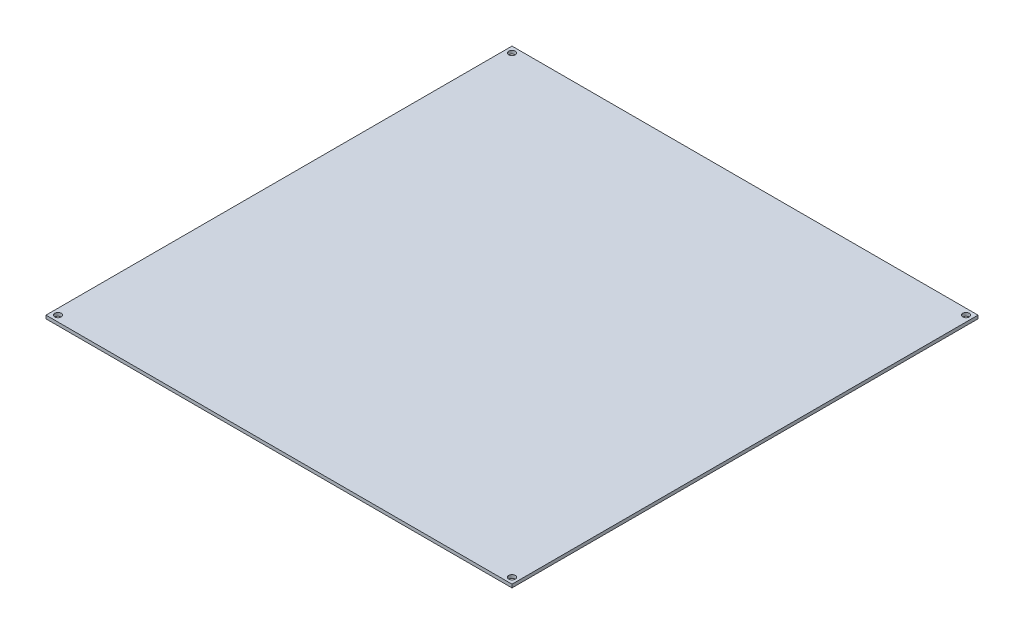
ISO-10303-21;
HEADER;
FILE_DESCRIPTION(('STEP AP214'),'2;1');
FILE_NAME('part.step','',(''),(''),'','','');
FILE_SCHEMA(('AUTOMOTIVE_DESIGN { 1 0 10303 214 1 1 1 1 }'));
ENDSEC;
DATA;
#1=APPLICATION_CONTEXT('core data for automotive mechanical design processes');
#2=APPLICATION_PROTOCOL_DEFINITION('international standard','automotive_design',2000,#1);
#3=PRODUCT_CONTEXT('',#1,'mechanical');
#4=PRODUCT('Part','Part','',(#3));
#5=PRODUCT_RELATED_PRODUCT_CATEGORY('part','',(#4));
#6=PRODUCT_DEFINITION_FORMATION('','',#4);
#7=PRODUCT_DEFINITION_CONTEXT('part definition',#1,'design');
#8=PRODUCT_DEFINITION('design','',#6,#7);
#9=PRODUCT_DEFINITION_SHAPE('','',#8);
#10=(LENGTH_UNIT() NAMED_UNIT(*) SI_UNIT(.MILLI.,.METRE.));
#11=(NAMED_UNIT(*) PLANE_ANGLE_UNIT() SI_UNIT($,.RADIAN.));
#12=(NAMED_UNIT(*) SI_UNIT($,.STERADIAN.) SOLID_ANGLE_UNIT());
#13=UNCERTAINTY_MEASURE_WITH_UNIT(LENGTH_MEASURE(1.E-05),#10,'distance_accuracy_value','');
#14=(GEOMETRIC_REPRESENTATION_CONTEXT(3) GLOBAL_UNCERTAINTY_ASSIGNED_CONTEXT((#13)) GLOBAL_UNIT_ASSIGNED_CONTEXT((#10,
#11,#12)) REPRESENTATION_CONTEXT('',''));
#15=CARTESIAN_POINT('',(0.,0.,0.));
#16=DIRECTION('',(0.,0.,1.));
#17=DIRECTION('',(1.,0.,0.));
#18=AXIS2_PLACEMENT_3D('',#15,#16,#17);
#19=CARTESIAN_POINT('',(0.,1.5,0.));
#20=DIRECTION('',(0.,1.,0.));
#21=DIRECTION('',(0.,0.,1.));
#22=AXIS2_PLACEMENT_3D('',#19,#20,#21);
#23=PLANE('',#22);
#24=CARTESIAN_POINT('',(-122.293137254902,1.5,149.567647058824));
#25=DIRECTION('',(0.,1.,0.));
#26=DIRECTION('',(0.,0.,1.));
#27=AXIS2_PLACEMENT_3D('',#24,#25,#26);
#28=CIRCLE('',#27,1.5);
#29=CARTESIAN_POINT('',(-122.293137254902,1.5,151.067647058824));
#30=VERTEX_POINT('',#29);
#31=EDGE_CURVE('E127',#30,#30,#28,.T.);
#32=ORIENTED_EDGE('',*,*,#31,.F.);
#33=EDGE_LOOP('',(#32));
#34=FACE_BOUND('',#33,.T.);
#35=CARTESIAN_POINT('',(-122.293137254902,1.5,-58.9323529411764));
#36=DIRECTION('',(0.,1.,0.));
#37=DIRECTION('',(0.,0.,1.));
#38=AXIS2_PLACEMENT_3D('',#35,#36,#37);
#39=CIRCLE('',#38,1.5);
#40=CARTESIAN_POINT('',(-122.293137254902,1.5,-57.4323529411764));
#41=VERTEX_POINT('',#40);
#42=EDGE_CURVE('E106',#41,#41,#39,.T.);
#43=ORIENTED_EDGE('',*,*,#42,.F.);
#44=EDGE_LOOP('',(#43));
#45=FACE_BOUND('',#44,.T.);
#46=DIRECTION('',(0.,0.,1.));
#47=VECTOR('',#46,1.);
#48=CARTESIAN_POINT('',(-125.043137254902,1.5,-61.6823529411765));
#49=LINE('',#48,#47);
#50=CARTESIAN_POINT('',(-125.043137254902,1.5,-61.6823529411765));
#51=VERTEX_POINT('',#50);
#52=CARTESIAN_POINT('',(-125.043137254902,1.5,152.317647058824));
#53=VERTEX_POINT('',#52);
#54=EDGE_CURVE('E91',#51,#53,#49,.T.);
#55=ORIENTED_EDGE('',*,*,#54,.T.);
#56=DIRECTION('',(1.,0.,0.));
#57=VECTOR('',#56,1.);
#58=CARTESIAN_POINT('',(-125.043137254902,1.5,152.317647058824));
#59=LINE('',#58,#57);
#60=CARTESIAN_POINT('',(88.9568627450981,1.5,152.317647058824));
#61=VERTEX_POINT('',#60);
#62=EDGE_CURVE('E86',#53,#61,#59,.T.);
#63=ORIENTED_EDGE('',*,*,#62,.T.);
#64=DIRECTION('',(0.,0.,-1.));
#65=VECTOR('',#64,1.);
#66=CARTESIAN_POINT('',(88.9568627450981,1.5,-61.6823529411765));
#67=LINE('',#66,#65);
#68=CARTESIAN_POINT('',(88.9568627450981,1.5,-61.6823529411765));
#69=VERTEX_POINT('',#68);
#70=EDGE_CURVE('E89',#61,#69,#67,.T.);
#71=ORIENTED_EDGE('',*,*,#70,.T.);
#72=DIRECTION('',(-1.,0.,0.));
#73=VECTOR('',#72,1.);
#74=CARTESIAN_POINT('',(-125.043137254902,1.5,-61.6823529411765));
#75=LINE('',#74,#73);
#76=EDGE_CURVE('E56',#69,#51,#75,.T.);
#77=ORIENTED_EDGE('',*,*,#76,.T.);
#78=EDGE_LOOP('',(#55,#63,#71,#77));
#79=FACE_BOUND('',#78,.T.);
#80=CARTESIAN_POINT('',(86.2068627450981,1.5,-58.9323529411764));
#81=DIRECTION('',(0.,1.,0.));
#82=DIRECTION('',(0.,0.,1.));
#83=AXIS2_PLACEMENT_3D('',#80,#81,#82);
#84=CIRCLE('',#83,1.5);
#85=CARTESIAN_POINT('',(86.2068627450981,1.5,-57.4323529411764));
#86=VERTEX_POINT('',#85);
#87=EDGE_CURVE('E121',#86,#86,#84,.T.);
#88=ORIENTED_EDGE('',*,*,#87,.F.);
#89=EDGE_LOOP('',(#88));
#90=FACE_BOUND('',#89,.T.);
#91=CARTESIAN_POINT('',(86.2068627450981,1.5,149.567647058824));
#92=DIRECTION('',(0.,1.,0.));
#93=DIRECTION('',(0.,0.,1.));
#94=AXIS2_PLACEMENT_3D('',#91,#92,#93);
#95=CIRCLE('',#94,1.5);
#96=CARTESIAN_POINT('',(86.2068627450981,1.5,151.067647058824));
#97=VERTEX_POINT('',#96);
#98=EDGE_CURVE('E133',#97,#97,#95,.T.);
#99=ORIENTED_EDGE('',*,*,#98,.F.);
#100=EDGE_LOOP('',(#99));
#101=FACE_BOUND('',#100,.T.);
#102=ADVANCED_FACE('F39',(#34,#45,#79,#90,#101),#23,.T.);
#103=CARTESIAN_POINT('',(0.,0.,0.));
#104=DIRECTION('',(0.,1.,0.));
#105=DIRECTION('',(0.,0.,1.));
#106=AXIS2_PLACEMENT_3D('',#103,#104,#105);
#107=PLANE('',#106);
#108=CARTESIAN_POINT('',(-122.293137254902,0.,149.567647058824));
#109=DIRECTION('',(0.,1.,0.));
#110=DIRECTION('',(0.,0.,1.));
#111=AXIS2_PLACEMENT_3D('',#108,#109,#110);
#112=CIRCLE('',#111,1.5);
#113=CARTESIAN_POINT('',(-122.293137254902,0.,151.067647058824));
#114=VERTEX_POINT('',#113);
#115=EDGE_CURVE('E130',#114,#114,#112,.T.);
#116=ORIENTED_EDGE('',*,*,#115,.T.);
#117=EDGE_LOOP('',(#116));
#118=FACE_BOUND('',#117,.T.);
#119=CARTESIAN_POINT('',(-122.293137254902,0.,-58.9323529411764));
#120=DIRECTION('',(0.,1.,0.));
#121=DIRECTION('',(0.,0.,1.));
#122=AXIS2_PLACEMENT_3D('',#119,#120,#121);
#123=CIRCLE('',#122,1.5);
#124=CARTESIAN_POINT('',(-122.293137254902,0.,-57.4323529411764));
#125=VERTEX_POINT('',#124);
#126=EDGE_CURVE('E118',#125,#125,#123,.T.);
#127=ORIENTED_EDGE('',*,*,#126,.T.);
#128=EDGE_LOOP('',(#127));
#129=FACE_BOUND('',#128,.T.);
#130=DIRECTION('',(0.,0.,1.));
#131=VECTOR('',#130,1.);
#132=CARTESIAN_POINT('',(-125.043137254902,0.,-61.6823529411765));
#133=LINE('',#132,#131);
#134=CARTESIAN_POINT('',(-125.043137254902,0.,-61.6823529411765));
#135=VERTEX_POINT('',#134);
#136=CARTESIAN_POINT('',(-125.043137254902,0.,152.317647058824));
#137=VERTEX_POINT('',#136);
#138=EDGE_CURVE('E103',#135,#137,#133,.T.);
#139=ORIENTED_EDGE('',*,*,#138,.F.);
#140=DIRECTION('',(-1.,0.,0.));
#141=VECTOR('',#140,1.);
#142=CARTESIAN_POINT('',(-125.043137254902,0.,-61.6823529411765));
#143=LINE('',#142,#141);
#144=CARTESIAN_POINT('',(88.9568627450981,0.,-61.6823529411765));
#145=VERTEX_POINT('',#144);
#146=EDGE_CURVE('E79',#145,#135,#143,.T.);
#147=ORIENTED_EDGE('',*,*,#146,.F.);
#148=DIRECTION('',(0.,0.,-1.));
#149=VECTOR('',#148,1.);
#150=CARTESIAN_POINT('',(88.9568627450981,0.,-61.6823529411765));
#151=LINE('',#150,#149);
#152=CARTESIAN_POINT('',(88.9568627450981,0.,152.317647058824));
#153=VERTEX_POINT('',#152);
#154=EDGE_CURVE('E73',#153,#145,#151,.T.);
#155=ORIENTED_EDGE('',*,*,#154,.F.);
#156=DIRECTION('',(1.,0.,0.));
#157=VECTOR('',#156,1.);
#158=CARTESIAN_POINT('',(-125.043137254902,0.,152.317647058824));
#159=LINE('',#158,#157);
#160=EDGE_CURVE('E95',#137,#153,#159,.T.);
#161=ORIENTED_EDGE('',*,*,#160,.F.);
#162=EDGE_LOOP('',(#139,#147,#155,#161));
#163=FACE_BOUND('',#162,.T.);
#164=CARTESIAN_POINT('',(86.2068627450981,0.,-58.9323529411764));
#165=DIRECTION('',(0.,1.,0.));
#166=DIRECTION('',(0.,0.,1.));
#167=AXIS2_PLACEMENT_3D('',#164,#165,#166);
#168=CIRCLE('',#167,1.5);
#169=CARTESIAN_POINT('',(86.2068627450981,0.,-57.4323529411764));
#170=VERTEX_POINT('',#169);
#171=EDGE_CURVE('E124',#170,#170,#168,.T.);
#172=ORIENTED_EDGE('',*,*,#171,.T.);
#173=EDGE_LOOP('',(#172));
#174=FACE_BOUND('',#173,.T.);
#175=CARTESIAN_POINT('',(86.2068627450981,0.,149.567647058824));
#176=DIRECTION('',(0.,1.,0.));
#177=DIRECTION('',(0.,0.,1.));
#178=AXIS2_PLACEMENT_3D('',#175,#176,#177);
#179=CIRCLE('',#178,1.5);
#180=CARTESIAN_POINT('',(86.2068627450981,0.,151.067647058824));
#181=VERTEX_POINT('',#180);
#182=EDGE_CURVE('E136',#181,#181,#179,.T.);
#183=ORIENTED_EDGE('',*,*,#182,.T.);
#184=EDGE_LOOP('',(#183));
#185=FACE_BOUND('',#184,.T.);
#186=ADVANCED_FACE('F114',(#118,#129,#163,#174,#185),#107,.F.);
#187=CARTESIAN_POINT('',(-125.043137254902,1.5,-61.6823529411765));
#188=DIRECTION('',(1.,0.,0.));
#189=DIRECTION('',(0.,0.,-1.));
#190=AXIS2_PLACEMENT_3D('',#187,#188,#189);
#191=PLANE('',#190);
#192=ORIENTED_EDGE('',*,*,#138,.T.);
#193=DIRECTION('',(0.,-1.,0.));
#194=VECTOR('',#193,1.);
#195=CARTESIAN_POINT('',(-125.043137254902,1.5,152.317647058824));
#196=LINE('',#195,#194);
#197=EDGE_CURVE('E11',#53,#137,#196,.T.);
#198=ORIENTED_EDGE('',*,*,#197,.F.);
#199=ORIENTED_EDGE('',*,*,#54,.F.);
#200=DIRECTION('',(0.,-1.,0.));
#201=VECTOR('',#200,1.);
#202=CARTESIAN_POINT('',(-125.043137254902,1.5,-61.6823529411765));
#203=LINE('',#202,#201);
#204=EDGE_CURVE('E99',#51,#135,#203,.T.);
#205=ORIENTED_EDGE('',*,*,#204,.T.);
#206=EDGE_LOOP('',(#192,#198,#199,#205));
#207=FACE_BOUND('',#206,.T.);
#208=ADVANCED_FACE('F41',(#207),#191,.F.);
#209=CARTESIAN_POINT('',(-125.043137254902,1.5,152.317647058824));
#210=DIRECTION('',(0.,0.,-1.));
#211=DIRECTION('',(-1.,0.,0.));
#212=AXIS2_PLACEMENT_3D('',#209,#210,#211);
#213=PLANE('',#212);
#214=ORIENTED_EDGE('',*,*,#160,.T.);
#215=DIRECTION('',(0.,-1.,0.));
#216=VECTOR('',#215,1.);
#217=CARTESIAN_POINT('',(88.9568627450981,1.5,152.317647058824));
#218=LINE('',#217,#216);
#219=EDGE_CURVE('E48',#61,#153,#218,.T.);
#220=ORIENTED_EDGE('',*,*,#219,.F.);
#221=ORIENTED_EDGE('',*,*,#62,.F.);
#222=ORIENTED_EDGE('',*,*,#197,.T.);
#223=EDGE_LOOP('',(#214,#220,#221,#222));
#224=FACE_BOUND('',#223,.T.);
#225=ADVANCED_FACE('F94',(#224),#213,.F.);
#226=CARTESIAN_POINT('',(88.9568627450981,1.5,-61.6823529411765));
#227=DIRECTION('',(-1.,0.,0.));
#228=DIRECTION('',(0.,0.,1.));
#229=AXIS2_PLACEMENT_3D('',#226,#227,#228);
#230=PLANE('',#229);
#231=ORIENTED_EDGE('',*,*,#154,.T.);
#232=DIRECTION('',(0.,-1.,0.));
#233=VECTOR('',#232,1.);
#234=CARTESIAN_POINT('',(88.9568627450981,1.5,-61.6823529411765));
#235=LINE('',#234,#233);
#236=EDGE_CURVE('E96',#69,#145,#235,.T.);
#237=ORIENTED_EDGE('',*,*,#236,.F.);
#238=ORIENTED_EDGE('',*,*,#70,.F.);
#239=ORIENTED_EDGE('',*,*,#219,.T.);
#240=EDGE_LOOP('',(#231,#237,#238,#239));
#241=FACE_BOUND('',#240,.T.);
#242=ADVANCED_FACE('F97',(#241),#230,.F.);
#243=CARTESIAN_POINT('',(-125.043137254902,1.5,-61.6823529411765));
#244=DIRECTION('',(0.,0.,1.));
#245=DIRECTION('',(1.,0.,0.));
#246=AXIS2_PLACEMENT_3D('',#243,#244,#245);
#247=PLANE('',#246);
#248=ORIENTED_EDGE('',*,*,#146,.T.);
#249=ORIENTED_EDGE('',*,*,#204,.F.);
#250=ORIENTED_EDGE('',*,*,#76,.F.);
#251=ORIENTED_EDGE('',*,*,#236,.T.);
#252=EDGE_LOOP('',(#248,#249,#250,#251));
#253=FACE_BOUND('',#252,.T.);
#254=ADVANCED_FACE('F111',(#253),#247,.F.);
#255=CARTESIAN_POINT('',(-122.293137254902,1.5,-58.9323529411764));
#256=DIRECTION('',(0.,-1.,0.));
#257=DIRECTION('',(0.,0.,-1.));
#258=AXIS2_PLACEMENT_3D('',#255,#256,#257);
#259=CYLINDRICAL_SURFACE('',#258,1.5);
#260=ORIENTED_EDGE('',*,*,#42,.T.);
#261=EDGE_LOOP('',(#260));
#262=FACE_BOUND('',#261,.T.);
#263=ORIENTED_EDGE('',*,*,#126,.F.);
#264=EDGE_LOOP('',(#263));
#265=FACE_BOUND('',#264,.T.);
#266=ADVANCED_FACE('F156',(#262,#265),#259,.F.);
#267=CARTESIAN_POINT('',(86.2068627450981,1.5,-58.9323529411764));
#268=DIRECTION('',(0.,-1.,0.));
#269=DIRECTION('',(0.,0.,-1.));
#270=AXIS2_PLACEMENT_3D('',#267,#268,#269);
#271=CYLINDRICAL_SURFACE('',#270,1.5);
#272=ORIENTED_EDGE('',*,*,#87,.T.);
#273=EDGE_LOOP('',(#272));
#274=FACE_BOUND('',#273,.T.);
#275=ORIENTED_EDGE('',*,*,#171,.F.);
#276=EDGE_LOOP('',(#275));
#277=FACE_BOUND('',#276,.T.);
#278=ADVANCED_FACE('F202',(#274,#277),#271,.F.);
#279=CARTESIAN_POINT('',(-122.293137254902,1.5,149.567647058824));
#280=DIRECTION('',(0.,-1.,0.));
#281=DIRECTION('',(0.,0.,-1.));
#282=AXIS2_PLACEMENT_3D('',#279,#280,#281);
#283=CYLINDRICAL_SURFACE('',#282,1.5);
#284=ORIENTED_EDGE('',*,*,#31,.T.);
#285=EDGE_LOOP('',(#284));
#286=FACE_BOUND('',#285,.T.);
#287=ORIENTED_EDGE('',*,*,#115,.F.);
#288=EDGE_LOOP('',(#287));
#289=FACE_BOUND('',#288,.T.);
#290=ADVANCED_FACE('F210',(#286,#289),#283,.F.);
#291=CARTESIAN_POINT('',(86.2068627450981,1.5,149.567647058824));
#292=DIRECTION('',(0.,-1.,0.));
#293=DIRECTION('',(0.,0.,-1.));
#294=AXIS2_PLACEMENT_3D('',#291,#292,#293);
#295=CYLINDRICAL_SURFACE('',#294,1.5);
#296=ORIENTED_EDGE('',*,*,#98,.T.);
#297=EDGE_LOOP('',(#296));
#298=FACE_BOUND('',#297,.T.);
#299=ORIENTED_EDGE('',*,*,#182,.F.);
#300=EDGE_LOOP('',(#299));
#301=FACE_BOUND('',#300,.T.);
#302=ADVANCED_FACE('F142',(#298,#301),#295,.F.);
#303=CLOSED_SHELL('',(#102,#186,#208,#225,#242,#254,#266,#278,#290,#302));
#304=MANIFOLD_SOLID_BREP('B2',#303);
#305=ADVANCED_BREP_SHAPE_REPRESENTATION('',(#18,#304),#14);
#306=SHAPE_DEFINITION_REPRESENTATION(#9,#305);
ENDSEC;
END-ISO-10303-21;
